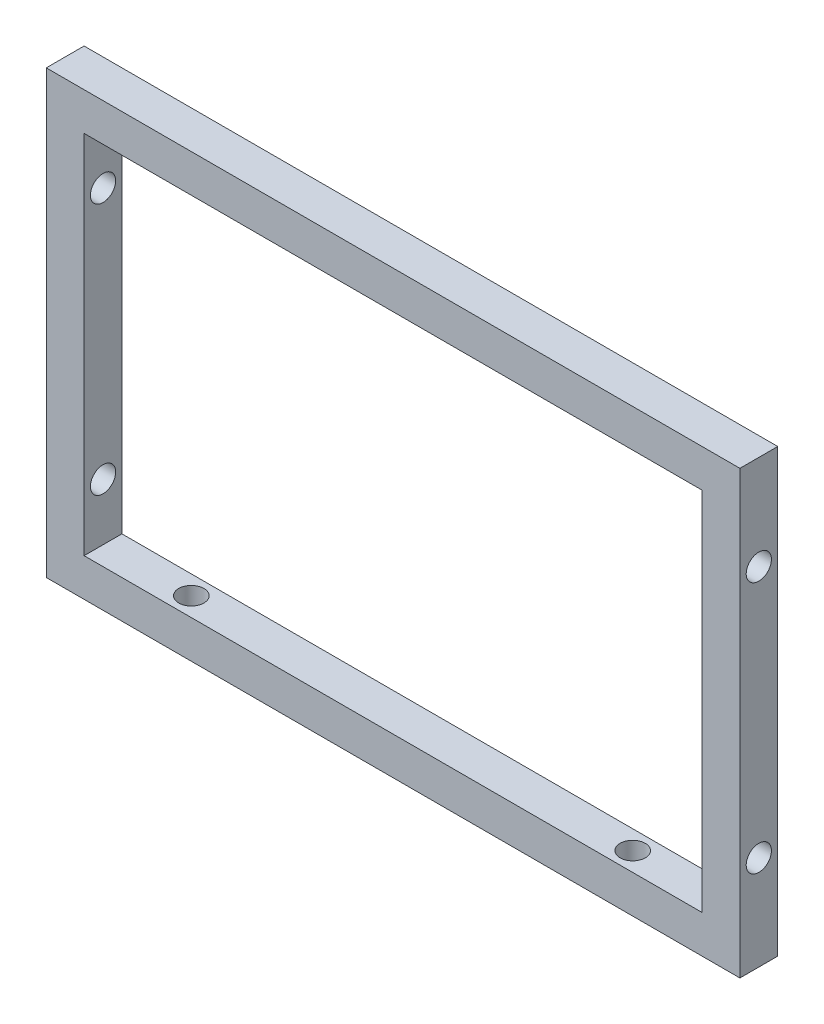
ISO-10303-21;
HEADER;
FILE_DESCRIPTION(('STEP AP214'),'2;1');
FILE_NAME('part.step','',(''),(''),'','','');
FILE_SCHEMA(('AUTOMOTIVE_DESIGN { 1 0 10303 214 1 1 1 1 }'));
ENDSEC;
DATA;
#1=APPLICATION_CONTEXT('core data for automotive mechanical design processes');
#2=APPLICATION_PROTOCOL_DEFINITION('international standard','automotive_design',2000,#1);
#3=PRODUCT_CONTEXT('',#1,'mechanical');
#4=PRODUCT('Part','Part','',(#3));
#5=PRODUCT_RELATED_PRODUCT_CATEGORY('part','',(#4));
#6=PRODUCT_DEFINITION_FORMATION('','',#4);
#7=PRODUCT_DEFINITION_CONTEXT('part definition',#1,'design');
#8=PRODUCT_DEFINITION('design','',#6,#7);
#9=PRODUCT_DEFINITION_SHAPE('','',#8);
#10=(LENGTH_UNIT() NAMED_UNIT(*) SI_UNIT(.MILLI.,.METRE.));
#11=(NAMED_UNIT(*) PLANE_ANGLE_UNIT() SI_UNIT($,.RADIAN.));
#12=(NAMED_UNIT(*) SI_UNIT($,.STERADIAN.) SOLID_ANGLE_UNIT());
#13=UNCERTAINTY_MEASURE_WITH_UNIT(LENGTH_MEASURE(1.E-05),#10,'distance_accuracy_value','');
#14=(GEOMETRIC_REPRESENTATION_CONTEXT(3) GLOBAL_UNCERTAINTY_ASSIGNED_CONTEXT((#13)) GLOBAL_UNIT_ASSIGNED_CONTEXT((#10,
#11,#12)) REPRESENTATION_CONTEXT('',''));
#15=CARTESIAN_POINT('',(0.,0.,0.));
#16=DIRECTION('',(0.,0.,1.));
#17=DIRECTION('',(1.,0.,0.));
#18=AXIS2_PLACEMENT_3D('',#15,#16,#17);
#19=CARTESIAN_POINT('',(0.,0.,6.00000000000001));
#20=DIRECTION('',(0.,0.,-1.));
#21=DIRECTION('',(-1.,0.,0.));
#22=AXIS2_PLACEMENT_3D('',#19,#20,#21);
#23=PLANE('',#22);
#24=DIRECTION('',(0.,1.,0.));
#25=VECTOR('',#24,1.);
#26=CARTESIAN_POINT('',(55.,-35.,6.00000000000001));
#27=LINE('',#26,#25);
#28=CARTESIAN_POINT('',(55.,-35.,6.00000000000001));
#29=VERTEX_POINT('',#28);
#30=CARTESIAN_POINT('',(55.,35.,6.00000000000001));
#31=VERTEX_POINT('',#30);
#32=EDGE_CURVE('E232',#29,#31,#27,.T.);
#33=ORIENTED_EDGE('',*,*,#32,.T.);
#34=DIRECTION('',(-1.,0.,0.));
#35=VECTOR('',#34,1.);
#36=CARTESIAN_POINT('',(-55.,35.,6.00000000000001));
#37=LINE('',#36,#35);
#38=CARTESIAN_POINT('',(-55.,35.,6.00000000000001));
#39=VERTEX_POINT('',#38);
#40=EDGE_CURVE('E236',#31,#39,#37,.T.);
#41=ORIENTED_EDGE('',*,*,#40,.T.);
#42=DIRECTION('',(0.,-1.,0.));
#43=VECTOR('',#42,1.);
#44=CARTESIAN_POINT('',(-55.,-35.,6.00000000000001));
#45=LINE('',#44,#43);
#46=CARTESIAN_POINT('',(-55.,-35.,6.00000000000001));
#47=VERTEX_POINT('',#46);
#48=EDGE_CURVE('E284',#39,#47,#45,.T.);
#49=ORIENTED_EDGE('',*,*,#48,.T.);
#50=DIRECTION('',(1.,0.,0.));
#51=VECTOR('',#50,1.);
#52=CARTESIAN_POINT('',(-55.,-35.,6.00000000000001));
#53=LINE('',#52,#51);
#54=EDGE_CURVE('E282',#47,#29,#53,.T.);
#55=ORIENTED_EDGE('',*,*,#54,.T.);
#56=EDGE_LOOP('',(#33,#41,#49,#55));
#57=FACE_BOUND('',#56,.T.);
#58=DIRECTION('',(0.,1.,0.));
#59=VECTOR('',#58,1.);
#60=CARTESIAN_POINT('',(49.,-29.,6.00000000000001));
#61=LINE('',#60,#59);
#62=CARTESIAN_POINT('',(49.,-29.,6.00000000000001));
#63=VERTEX_POINT('',#62);
#64=CARTESIAN_POINT('',(49.,29.,6.00000000000001));
#65=VERTEX_POINT('',#64);
#66=EDGE_CURVE('E112',#63,#65,#61,.T.);
#67=ORIENTED_EDGE('',*,*,#66,.F.);
#68=DIRECTION('',(1.,0.,0.));
#69=VECTOR('',#68,1.);
#70=CARTESIAN_POINT('',(-49.,-29.,6.00000000000001));
#71=LINE('',#70,#69);
#72=CARTESIAN_POINT('',(-49.,-29.,6.00000000000001));
#73=VERTEX_POINT('',#72);
#74=EDGE_CURVE('E134',#73,#63,#71,.T.);
#75=ORIENTED_EDGE('',*,*,#74,.F.);
#76=DIRECTION('',(0.,-1.,0.));
#77=VECTOR('',#76,1.);
#78=CARTESIAN_POINT('',(-49.,-29.,6.00000000000001));
#79=LINE('',#78,#77);
#80=CARTESIAN_POINT('',(-49.,29.,6.00000000000001));
#81=VERTEX_POINT('',#80);
#82=EDGE_CURVE('E132',#81,#73,#79,.T.);
#83=ORIENTED_EDGE('',*,*,#82,.F.);
#84=DIRECTION('',(-1.,0.,0.));
#85=VECTOR('',#84,1.);
#86=CARTESIAN_POINT('',(-49.,29.,6.00000000000001));
#87=LINE('',#86,#85);
#88=EDGE_CURVE('E120',#65,#81,#87,.T.);
#89=ORIENTED_EDGE('',*,*,#88,.F.);
#90=EDGE_LOOP('',(#67,#75,#83,#89));
#91=FACE_BOUND('',#90,.T.);
#92=ADVANCED_FACE('F44',(#57,#91),#23,.F.);
#93=CARTESIAN_POINT('',(0.,0.,0.));
#94=DIRECTION('',(0.,0.,-1.));
#95=DIRECTION('',(-1.,0.,0.));
#96=AXIS2_PLACEMENT_3D('',#93,#94,#95);
#97=PLANE('',#96);
#98=DIRECTION('',(0.,1.,0.));
#99=VECTOR('',#98,1.);
#100=CARTESIAN_POINT('',(55.,-35.,0.));
#101=LINE('',#100,#99);
#102=CARTESIAN_POINT('',(55.,-35.,0.));
#103=VERTEX_POINT('',#102);
#104=CARTESIAN_POINT('',(55.,35.,0.));
#105=VERTEX_POINT('',#104);
#106=EDGE_CURVE('E128',#103,#105,#101,.T.);
#107=ORIENTED_EDGE('',*,*,#106,.F.);
#108=DIRECTION('',(1.,0.,0.));
#109=VECTOR('',#108,1.);
#110=CARTESIAN_POINT('',(-55.,-35.,0.));
#111=LINE('',#110,#109);
#112=CARTESIAN_POINT('',(-55.,-35.,0.));
#113=VERTEX_POINT('',#112);
#114=EDGE_CURVE('E237',#113,#103,#111,.T.);
#115=ORIENTED_EDGE('',*,*,#114,.F.);
#116=DIRECTION('',(0.,-1.,0.));
#117=VECTOR('',#116,1.);
#118=CARTESIAN_POINT('',(-55.,-35.,0.));
#119=LINE('',#118,#117);
#120=CARTESIAN_POINT('',(-55.,35.,0.));
#121=VERTEX_POINT('',#120);
#122=EDGE_CURVE('E266',#121,#113,#119,.T.);
#123=ORIENTED_EDGE('',*,*,#122,.F.);
#124=DIRECTION('',(-1.,0.,0.));
#125=VECTOR('',#124,1.);
#126=CARTESIAN_POINT('',(-55.,35.,0.));
#127=LINE('',#126,#125);
#128=EDGE_CURVE('E269',#105,#121,#127,.T.);
#129=ORIENTED_EDGE('',*,*,#128,.F.);
#130=EDGE_LOOP('',(#107,#115,#123,#129));
#131=FACE_BOUND('',#130,.T.);
#132=DIRECTION('',(1.,0.,0.));
#133=VECTOR('',#132,1.);
#134=CARTESIAN_POINT('',(-49.,-29.,0.));
#135=LINE('',#134,#133);
#136=CARTESIAN_POINT('',(-49.,-29.,0.));
#137=VERTEX_POINT('',#136);
#138=CARTESIAN_POINT('',(49.,-29.,0.));
#139=VERTEX_POINT('',#138);
#140=EDGE_CURVE('E121',#137,#139,#135,.T.);
#141=ORIENTED_EDGE('',*,*,#140,.T.);
#142=DIRECTION('',(0.,1.,0.));
#143=VECTOR('',#142,1.);
#144=CARTESIAN_POINT('',(49.,-29.,0.));
#145=LINE('',#144,#143);
#146=CARTESIAN_POINT('',(49.,29.,0.));
#147=VERTEX_POINT('',#146);
#148=EDGE_CURVE('E70',#139,#147,#145,.T.);
#149=ORIENTED_EDGE('',*,*,#148,.T.);
#150=DIRECTION('',(-1.,0.,0.));
#151=VECTOR('',#150,1.);
#152=CARTESIAN_POINT('',(-49.,29.,0.));
#153=LINE('',#152,#151);
#154=CARTESIAN_POINT('',(-49.,29.,0.));
#155=VERTEX_POINT('',#154);
#156=EDGE_CURVE('E127',#147,#155,#153,.T.);
#157=ORIENTED_EDGE('',*,*,#156,.T.);
#158=DIRECTION('',(0.,-1.,0.));
#159=VECTOR('',#158,1.);
#160=CARTESIAN_POINT('',(-49.,-29.,0.));
#161=LINE('',#160,#159);
#162=EDGE_CURVE('E252',#155,#137,#161,.T.);
#163=ORIENTED_EDGE('',*,*,#162,.T.);
#164=EDGE_LOOP('',(#141,#149,#157,#163));
#165=FACE_BOUND('',#164,.T.);
#166=ADVANCED_FACE('F310',(#131,#165),#97,.T.);
#167=CARTESIAN_POINT('',(55.,-35.,6.00000000000001));
#168=DIRECTION('',(-1.,0.,0.));
#169=DIRECTION('',(0.,0.,1.));
#170=AXIS2_PLACEMENT_3D('',#167,#168,#169);
#171=PLANE('',#170);
#172=CARTESIAN_POINT('',(55.,20.,3.));
#173=DIRECTION('',(1.,0.,0.));
#174=DIRECTION('',(0.,0.,-1.));
#175=AXIS2_PLACEMENT_3D('',#172,#173,#174);
#176=CIRCLE('',#175,2.);
#177=CARTESIAN_POINT('',(55.,20.,1.));
#178=VERTEX_POINT('',#177);
#179=EDGE_CURVE('E342',#178,#178,#176,.T.);
#180=ORIENTED_EDGE('',*,*,#179,.F.);
#181=EDGE_LOOP('',(#180));
#182=FACE_BOUND('',#181,.T.);
#183=CARTESIAN_POINT('',(55.,-20.,3.));
#184=DIRECTION('',(1.,0.,0.));
#185=DIRECTION('',(0.,0.,-1.));
#186=AXIS2_PLACEMENT_3D('',#183,#184,#185);
#187=CIRCLE('',#186,2.);
#188=CARTESIAN_POINT('',(55.,-20.,1.));
#189=VERTEX_POINT('',#188);
#190=EDGE_CURVE('E345',#189,#189,#187,.T.);
#191=ORIENTED_EDGE('',*,*,#190,.F.);
#192=EDGE_LOOP('',(#191));
#193=FACE_BOUND('',#192,.T.);
#194=ORIENTED_EDGE('',*,*,#106,.T.);
#195=DIRECTION('',(0.,0.,-1.));
#196=VECTOR('',#195,1.);
#197=CARTESIAN_POINT('',(55.,35.,6.00000000000001));
#198=LINE('',#197,#196);
#199=EDGE_CURVE('E12',#31,#105,#198,.T.);
#200=ORIENTED_EDGE('',*,*,#199,.F.);
#201=ORIENTED_EDGE('',*,*,#32,.F.);
#202=DIRECTION('',(0.,0.,-1.));
#203=VECTOR('',#202,1.);
#204=CARTESIAN_POINT('',(55.,-35.,6.00000000000001));
#205=LINE('',#204,#203);
#206=EDGE_CURVE('E276',#29,#103,#205,.T.);
#207=ORIENTED_EDGE('',*,*,#206,.T.);
#208=EDGE_LOOP('',(#194,#200,#201,#207));
#209=FACE_BOUND('',#208,.T.);
#210=ADVANCED_FACE('F46',(#182,#193,#209),#171,.F.);
#211=CARTESIAN_POINT('',(-55.,35.,6.00000000000001));
#212=DIRECTION('',(0.,-1.,0.));
#213=DIRECTION('',(0.,0.,-1.));
#214=AXIS2_PLACEMENT_3D('',#211,#212,#213);
#215=PLANE('',#214);
#216=ORIENTED_EDGE('',*,*,#128,.T.);
#217=DIRECTION('',(0.,0.,-1.));
#218=VECTOR('',#217,1.);
#219=CARTESIAN_POINT('',(-55.,35.,6.00000000000001));
#220=LINE('',#219,#218);
#221=EDGE_CURVE('E54',#39,#121,#220,.T.);
#222=ORIENTED_EDGE('',*,*,#221,.F.);
#223=ORIENTED_EDGE('',*,*,#40,.F.);
#224=ORIENTED_EDGE('',*,*,#199,.T.);
#225=EDGE_LOOP('',(#216,#222,#223,#224));
#226=FACE_BOUND('',#225,.T.);
#227=ADVANCED_FACE('F300',(#226),#215,.F.);
#228=CARTESIAN_POINT('',(-55.,-35.,6.00000000000001));
#229=DIRECTION('',(1.,0.,0.));
#230=DIRECTION('',(0.,0.,-1.));
#231=AXIS2_PLACEMENT_3D('',#228,#229,#230);
#232=PLANE('',#231);
#233=CARTESIAN_POINT('',(-55.,20.,3.));
#234=DIRECTION('',(1.,0.,0.));
#235=DIRECTION('',(0.,0.,-1.));
#236=AXIS2_PLACEMENT_3D('',#233,#234,#235);
#237=CIRCLE('',#236,2.);
#238=CARTESIAN_POINT('',(-55.,20.,1.));
#239=VERTEX_POINT('',#238);
#240=EDGE_CURVE('E170',#239,#239,#237,.T.);
#241=ORIENTED_EDGE('',*,*,#240,.T.);
#242=EDGE_LOOP('',(#241));
#243=FACE_BOUND('',#242,.T.);
#244=CARTESIAN_POINT('',(-55.,-20.,3.));
#245=DIRECTION('',(1.,0.,0.));
#246=DIRECTION('',(0.,0.,-1.));
#247=AXIS2_PLACEMENT_3D('',#244,#245,#246);
#248=CIRCLE('',#247,2.);
#249=CARTESIAN_POINT('',(-55.,-20.,1.));
#250=VERTEX_POINT('',#249);
#251=EDGE_CURVE('E347',#250,#250,#248,.T.);
#252=ORIENTED_EDGE('',*,*,#251,.T.);
#253=EDGE_LOOP('',(#252));
#254=FACE_BOUND('',#253,.T.);
#255=ORIENTED_EDGE('',*,*,#122,.T.);
#256=DIRECTION('',(0.,0.,-1.));
#257=VECTOR('',#256,1.);
#258=CARTESIAN_POINT('',(-55.,-35.,6.00000000000001));
#259=LINE('',#258,#257);
#260=EDGE_CURVE('E308',#47,#113,#259,.T.);
#261=ORIENTED_EDGE('',*,*,#260,.F.);
#262=ORIENTED_EDGE('',*,*,#48,.F.);
#263=ORIENTED_EDGE('',*,*,#221,.T.);
#264=EDGE_LOOP('',(#255,#261,#262,#263));
#265=FACE_BOUND('',#264,.T.);
#266=ADVANCED_FACE('F305',(#243,#254,#265),#232,.F.);
#267=CARTESIAN_POINT('',(-55.,-35.,6.00000000000001));
#268=DIRECTION('',(0.,1.,0.));
#269=DIRECTION('',(0.,0.,1.));
#270=AXIS2_PLACEMENT_3D('',#267,#268,#269);
#271=PLANE('',#270);
#272=CARTESIAN_POINT('',(-35.,-35.,3.));
#273=DIRECTION('',(0.,-1.,0.));
#274=DIRECTION('',(0.,0.,-1.));
#275=AXIS2_PLACEMENT_3D('',#272,#273,#274);
#276=CIRCLE('',#275,2.);
#277=CARTESIAN_POINT('',(-35.,-35.,1.));
#278=VERTEX_POINT('',#277);
#279=EDGE_CURVE('E446',#278,#278,#276,.T.);
#280=ORIENTED_EDGE('',*,*,#279,.F.);
#281=EDGE_LOOP('',(#280));
#282=FACE_BOUND('',#281,.T.);
#283=CARTESIAN_POINT('',(35.,-35.,3.));
#284=DIRECTION('',(0.,-1.,0.));
#285=DIRECTION('',(0.,0.,-1.));
#286=AXIS2_PLACEMENT_3D('',#283,#284,#285);
#287=CIRCLE('',#286,2.);
#288=CARTESIAN_POINT('',(35.,-35.,1.));
#289=VERTEX_POINT('',#288);
#290=EDGE_CURVE('E200',#289,#289,#287,.T.);
#291=ORIENTED_EDGE('',*,*,#290,.F.);
#292=EDGE_LOOP('',(#291));
#293=FACE_BOUND('',#292,.T.);
#294=ORIENTED_EDGE('',*,*,#114,.T.);
#295=ORIENTED_EDGE('',*,*,#206,.F.);
#296=ORIENTED_EDGE('',*,*,#54,.F.);
#297=ORIENTED_EDGE('',*,*,#260,.T.);
#298=EDGE_LOOP('',(#294,#295,#296,#297));
#299=FACE_BOUND('',#298,.T.);
#300=ADVANCED_FACE('F314',(#282,#293,#299),#271,.F.);
#301=CARTESIAN_POINT('',(49.,-29.,6.00000000000001));
#302=DIRECTION('',(-1.,0.,0.));
#303=DIRECTION('',(0.,0.,1.));
#304=AXIS2_PLACEMENT_3D('',#301,#302,#303);
#305=PLANE('',#304);
#306=CARTESIAN_POINT('',(49.,20.,3.));
#307=DIRECTION('',(-1.,0.,0.));
#308=DIRECTION('',(0.,0.,1.));
#309=AXIS2_PLACEMENT_3D('',#306,#307,#308);
#310=CIRCLE('',#309,2.);
#311=CARTESIAN_POINT('',(49.,20.,5.));
#312=VERTEX_POINT('',#311);
#313=EDGE_CURVE('E196',#312,#312,#310,.T.);
#314=ORIENTED_EDGE('',*,*,#313,.F.);
#315=EDGE_LOOP('',(#314));
#316=FACE_BOUND('',#315,.T.);
#317=CARTESIAN_POINT('',(49.,-20.,3.));
#318=DIRECTION('',(-1.,0.,0.));
#319=DIRECTION('',(0.,0.,1.));
#320=AXIS2_PLACEMENT_3D('',#317,#318,#319);
#321=CIRCLE('',#320,2.);
#322=CARTESIAN_POINT('',(49.,-20.,5.));
#323=VERTEX_POINT('',#322);
#324=EDGE_CURVE('E169',#323,#323,#321,.T.);
#325=ORIENTED_EDGE('',*,*,#324,.F.);
#326=EDGE_LOOP('',(#325));
#327=FACE_BOUND('',#326,.T.);
#328=ORIENTED_EDGE('',*,*,#148,.F.);
#329=DIRECTION('',(0.,0.,-1.));
#330=VECTOR('',#329,1.);
#331=CARTESIAN_POINT('',(49.,-29.,6.00000000000001));
#332=LINE('',#331,#330);
#333=EDGE_CURVE('E116',#63,#139,#332,.T.);
#334=ORIENTED_EDGE('',*,*,#333,.F.);
#335=ORIENTED_EDGE('',*,*,#66,.T.);
#336=DIRECTION('',(0.,0.,-1.));
#337=VECTOR('',#336,1.);
#338=CARTESIAN_POINT('',(49.,29.,6.00000000000001));
#339=LINE('',#338,#337);
#340=EDGE_CURVE('E115',#65,#147,#339,.T.);
#341=ORIENTED_EDGE('',*,*,#340,.T.);
#342=EDGE_LOOP('',(#328,#334,#335,#341));
#343=FACE_BOUND('',#342,.T.);
#344=ADVANCED_FACE('F114',(#316,#327,#343),#305,.T.);
#345=CARTESIAN_POINT('',(-49.,29.,6.00000000000001));
#346=DIRECTION('',(0.,-1.,0.));
#347=DIRECTION('',(0.,0.,-1.));
#348=AXIS2_PLACEMENT_3D('',#345,#346,#347);
#349=PLANE('',#348);
#350=ORIENTED_EDGE('',*,*,#156,.F.);
#351=ORIENTED_EDGE('',*,*,#340,.F.);
#352=ORIENTED_EDGE('',*,*,#88,.T.);
#353=DIRECTION('',(0.,0.,-1.));
#354=VECTOR('',#353,1.);
#355=CARTESIAN_POINT('',(-49.,29.,6.00000000000001));
#356=LINE('',#355,#354);
#357=EDGE_CURVE('E129',#81,#155,#356,.T.);
#358=ORIENTED_EDGE('',*,*,#357,.T.);
#359=EDGE_LOOP('',(#350,#351,#352,#358));
#360=FACE_BOUND('',#359,.T.);
#361=ADVANCED_FACE('F124',(#360),#349,.T.);
#362=CARTESIAN_POINT('',(-49.,-29.,6.00000000000001));
#363=DIRECTION('',(1.,0.,0.));
#364=DIRECTION('',(0.,0.,-1.));
#365=AXIS2_PLACEMENT_3D('',#362,#363,#364);
#366=PLANE('',#365);
#367=CARTESIAN_POINT('',(-49.,20.,3.));
#368=DIRECTION('',(1.,0.,0.));
#369=DIRECTION('',(0.,0.,-1.));
#370=AXIS2_PLACEMENT_3D('',#367,#368,#369);
#371=CIRCLE('',#370,2.);
#372=CARTESIAN_POINT('',(-49.,20.,1.));
#373=VERTEX_POINT('',#372);
#374=EDGE_CURVE('E48',#373,#373,#371,.T.);
#375=ORIENTED_EDGE('',*,*,#374,.F.);
#376=EDGE_LOOP('',(#375));
#377=FACE_BOUND('',#376,.T.);
#378=CARTESIAN_POINT('',(-49.,-20.,3.));
#379=DIRECTION('',(1.,0.,0.));
#380=DIRECTION('',(0.,0.,-1.));
#381=AXIS2_PLACEMENT_3D('',#378,#379,#380);
#382=CIRCLE('',#381,2.);
#383=CARTESIAN_POINT('',(-49.,-20.,1.));
#384=VERTEX_POINT('',#383);
#385=EDGE_CURVE('E166',#384,#384,#382,.T.);
#386=ORIENTED_EDGE('',*,*,#385,.F.);
#387=EDGE_LOOP('',(#386));
#388=FACE_BOUND('',#387,.T.);
#389=ORIENTED_EDGE('',*,*,#162,.F.);
#390=ORIENTED_EDGE('',*,*,#357,.F.);
#391=ORIENTED_EDGE('',*,*,#82,.T.);
#392=DIRECTION('',(0.,0.,-1.));
#393=VECTOR('',#392,1.);
#394=CARTESIAN_POINT('',(-49.,-29.,6.00000000000001));
#395=LINE('',#394,#393);
#396=EDGE_CURVE('E62',#73,#137,#395,.T.);
#397=ORIENTED_EDGE('',*,*,#396,.T.);
#398=EDGE_LOOP('',(#389,#390,#391,#397));
#399=FACE_BOUND('',#398,.T.);
#400=ADVANCED_FACE('F385',(#377,#388,#399),#366,.T.);
#401=CARTESIAN_POINT('',(-49.,-29.,6.00000000000001));
#402=DIRECTION('',(0.,1.,0.));
#403=DIRECTION('',(0.,0.,1.));
#404=AXIS2_PLACEMENT_3D('',#401,#402,#403);
#405=PLANE('',#404);
#406=CARTESIAN_POINT('',(-35.,-29.,3.));
#407=DIRECTION('',(0.,-1.,0.));
#408=DIRECTION('',(0.,0.,-1.));
#409=AXIS2_PLACEMENT_3D('',#406,#407,#408);
#410=CIRCLE('',#409,2.);
#411=CARTESIAN_POINT('',(-35.,-29.,1.));
#412=VERTEX_POINT('',#411);
#413=EDGE_CURVE('E203',#412,#412,#410,.T.);
#414=ORIENTED_EDGE('',*,*,#413,.T.);
#415=EDGE_LOOP('',(#414));
#416=FACE_BOUND('',#415,.T.);
#417=CARTESIAN_POINT('',(35.,-29.,3.));
#418=DIRECTION('',(0.,-1.,0.));
#419=DIRECTION('',(0.,0.,-1.));
#420=AXIS2_PLACEMENT_3D('',#417,#418,#419);
#421=CIRCLE('',#420,2.);
#422=CARTESIAN_POINT('',(35.,-29.,1.));
#423=VERTEX_POINT('',#422);
#424=EDGE_CURVE('E447',#423,#423,#421,.T.);
#425=ORIENTED_EDGE('',*,*,#424,.T.);
#426=EDGE_LOOP('',(#425));
#427=FACE_BOUND('',#426,.T.);
#428=ORIENTED_EDGE('',*,*,#140,.F.);
#429=ORIENTED_EDGE('',*,*,#396,.F.);
#430=ORIENTED_EDGE('',*,*,#74,.T.);
#431=ORIENTED_EDGE('',*,*,#333,.T.);
#432=EDGE_LOOP('',(#428,#429,#430,#431));
#433=FACE_BOUND('',#432,.T.);
#434=ADVANCED_FACE('F388',(#416,#427,#433),#405,.T.);
#435=CARTESIAN_POINT('',(35.,-29.,3.));
#436=DIRECTION('',(0.,-1.,0.));
#437=DIRECTION('',(0.,0.,-1.));
#438=AXIS2_PLACEMENT_3D('',#435,#436,#437);
#439=CYLINDRICAL_SURFACE('',#438,2.);
#440=ORIENTED_EDGE('',*,*,#424,.F.);
#441=EDGE_LOOP('',(#440));
#442=FACE_BOUND('',#441,.T.);
#443=ORIENTED_EDGE('',*,*,#290,.T.);
#444=EDGE_LOOP('',(#443));
#445=FACE_BOUND('',#444,.T.);
#446=ADVANCED_FACE('F396',(#442,#445),#439,.F.);
#447=CARTESIAN_POINT('',(-35.,-29.,3.));
#448=DIRECTION('',(0.,-1.,0.));
#449=DIRECTION('',(0.,0.,-1.));
#450=AXIS2_PLACEMENT_3D('',#447,#448,#449);
#451=CYLINDRICAL_SURFACE('',#450,2.);
#452=ORIENTED_EDGE('',*,*,#413,.F.);
#453=EDGE_LOOP('',(#452));
#454=FACE_BOUND('',#453,.T.);
#455=ORIENTED_EDGE('',*,*,#279,.T.);
#456=EDGE_LOOP('',(#455));
#457=FACE_BOUND('',#456,.T.);
#458=ADVANCED_FACE('F369',(#454,#457),#451,.F.);
#459=CARTESIAN_POINT('',(-55.,-20.,3.));
#460=DIRECTION('',(1.,0.,0.));
#461=DIRECTION('',(0.,0.,-1.));
#462=AXIS2_PLACEMENT_3D('',#459,#460,#461);
#463=CYLINDRICAL_SURFACE('',#462,2.);
#464=ORIENTED_EDGE('',*,*,#385,.T.);
#465=EDGE_LOOP('',(#464));
#466=FACE_BOUND('',#465,.T.);
#467=ORIENTED_EDGE('',*,*,#251,.F.);
#468=EDGE_LOOP('',(#467));
#469=FACE_BOUND('',#468,.T.);
#470=ADVANCED_FACE('F359',(#466,#469),#463,.F.);
#471=CARTESIAN_POINT('',(-55.,20.,3.));
#472=DIRECTION('',(1.,0.,0.));
#473=DIRECTION('',(0.,0.,-1.));
#474=AXIS2_PLACEMENT_3D('',#471,#472,#473);
#475=CYLINDRICAL_SURFACE('',#474,2.);
#476=ORIENTED_EDGE('',*,*,#374,.T.);
#477=EDGE_LOOP('',(#476));
#478=FACE_BOUND('',#477,.T.);
#479=ORIENTED_EDGE('',*,*,#240,.F.);
#480=EDGE_LOOP('',(#479));
#481=FACE_BOUND('',#480,.T.);
#482=ADVANCED_FACE('F356',(#478,#481),#475,.F.);
#483=ORIENTED_EDGE('',*,*,#324,.T.);
#484=EDGE_LOOP('',(#483));
#485=FACE_BOUND('',#484,.T.);
#486=ORIENTED_EDGE('',*,*,#190,.T.);
#487=EDGE_LOOP('',(#486));
#488=FACE_BOUND('',#487,.T.);
#489=ADVANCED_FACE('F358',(#485,#488),#463,.F.);
#490=ORIENTED_EDGE('',*,*,#313,.T.);
#491=EDGE_LOOP('',(#490));
#492=FACE_BOUND('',#491,.T.);
#493=ORIENTED_EDGE('',*,*,#179,.T.);
#494=EDGE_LOOP('',(#493));
#495=FACE_BOUND('',#494,.T.);
#496=ADVANCED_FACE('F362',(#492,#495),#475,.F.);
#497=CLOSED_SHELL('',(#92,#166,#210,#227,#266,#300,#344,#361,#400,#434,#446,#458,#470,#482,#489,#496));
#498=MANIFOLD_SOLID_BREP('B2',#497);
#499=ADVANCED_BREP_SHAPE_REPRESENTATION('',(#18,#498),#14);
#500=SHAPE_DEFINITION_REPRESENTATION(#9,#499);
ENDSEC;
END-ISO-10303-21;
